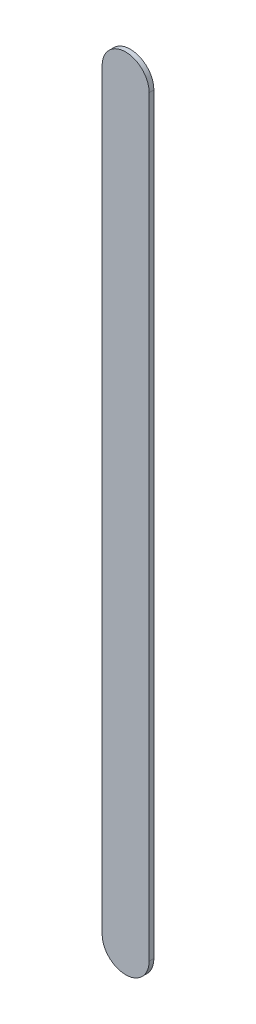
ISO-10303-21;
HEADER;
FILE_DESCRIPTION(('STEP AP214'),'2;1');
FILE_NAME('part.step','',(''),(''),'','','');
FILE_SCHEMA(('AUTOMOTIVE_DESIGN { 1 0 10303 214 1 1 1 1 }'));
ENDSEC;
DATA;
#1=APPLICATION_CONTEXT('core data for automotive mechanical design processes');
#2=APPLICATION_PROTOCOL_DEFINITION('international standard','automotive_design',2000,#1);
#3=PRODUCT_CONTEXT('',#1,'mechanical');
#4=PRODUCT('Part','Part','',(#3));
#5=PRODUCT_RELATED_PRODUCT_CATEGORY('part','',(#4));
#6=PRODUCT_DEFINITION_FORMATION('','',#4);
#7=PRODUCT_DEFINITION_CONTEXT('part definition',#1,'design');
#8=PRODUCT_DEFINITION('design','',#6,#7);
#9=PRODUCT_DEFINITION_SHAPE('','',#8);
#10=(LENGTH_UNIT() NAMED_UNIT(*) SI_UNIT(.MILLI.,.METRE.));
#11=(NAMED_UNIT(*) PLANE_ANGLE_UNIT() SI_UNIT($,.RADIAN.));
#12=(NAMED_UNIT(*) SI_UNIT($,.STERADIAN.) SOLID_ANGLE_UNIT());
#13=UNCERTAINTY_MEASURE_WITH_UNIT(LENGTH_MEASURE(1.E-05),#10,'distance_accuracy_value','');
#14=(GEOMETRIC_REPRESENTATION_CONTEXT(3) GLOBAL_UNCERTAINTY_ASSIGNED_CONTEXT((#13)) GLOBAL_UNIT_ASSIGNED_CONTEXT((#10,
#11,#12)) REPRESENTATION_CONTEXT('',''));
#15=CARTESIAN_POINT('',(0.,0.,0.));
#16=DIRECTION('',(0.,0.,1.));
#17=DIRECTION('',(1.,0.,0.));
#18=AXIS2_PLACEMENT_3D('',#15,#16,#17);
#19=CARTESIAN_POINT('',(14.648999633789,36.399998779297,0.0127));
#20=DIRECTION('',(0.,0.,1.));
#21=DIRECTION('',(1.,0.,0.));
#22=AXIS2_PLACEMENT_3D('',#19,#20,#21);
#23=PLANE('',#22);
#24=CARTESIAN_POINT('',(14.648999633789,35.383998413086,0.0127));
#25=DIRECTION('',(0.,0.,-1.));
#26=DIRECTION('',(1.,0.,0.));
#27=AXIS2_PLACEMENT_3D('',#24,#25,#26);
#28=CIRCLE('',#27,0.06350036621387);
#29=CARTESIAN_POINT('',(14.7125,35.383998718262,0.0127));
#30=VERTEX_POINT('',#29);
#31=CARTESIAN_POINT('',(14.585499267577,35.383998413086,0.0127));
#32=VERTEX_POINT('',#31);
#33=EDGE_CURVE('E100',#30,#32,#28,.T.);
#34=ORIENTED_EDGE('',*,*,#33,.F.);
#35=DIRECTION('',(0.,1.,0.));
#36=VECTOR('',#35,1.);
#37=CARTESIAN_POINT('',(14.7125,37.415998535156,0.0127));
#38=LINE('',#37,#36);
#39=CARTESIAN_POINT('',(14.712500000001,37.415999145508,0.0127));
#40=VERTEX_POINT('',#39);
#41=EDGE_CURVE('E70',#30,#40,#38,.T.);
#42=ORIENTED_EDGE('',*,*,#41,.T.);
#43=CARTESIAN_POINT('',(14.648999633789,37.415999145508,0.0127));
#44=DIRECTION('',(0.,0.,1.));
#45=DIRECTION('',(1.,0.,0.));
#46=AXIS2_PLACEMENT_3D('',#43,#44,#45);
#47=CIRCLE('',#46,0.06350036621387);
#48=CARTESIAN_POINT('',(14.585499267578,37.415998840332,0.0127));
#49=VERTEX_POINT('',#48);
#50=EDGE_CURVE('E94',#40,#49,#47,.T.);
#51=ORIENTED_EDGE('',*,*,#50,.T.);
#52=DIRECTION('',(0.,-1.,0.));
#53=VECTOR('',#52,1.);
#54=CARTESIAN_POINT('',(14.585499267578,35.383999023438,0.0127));
#55=LINE('',#54,#53);
#56=EDGE_CURVE('E11',#49,#32,#55,.T.);
#57=ORIENTED_EDGE('',*,*,#56,.T.);
#58=EDGE_LOOP('',(#34,#42,#51,#57));
#59=FACE_BOUND('',#58,.T.);
#60=ADVANCED_FACE('F17',(#59),#23,.T.);
#61=CARTESIAN_POINT('',(14.585499267578,35.383999023438,0.));
#62=DIRECTION('',(1.,0.,0.));
#63=DIRECTION('',(0.,1.,0.));
#64=AXIS2_PLACEMENT_3D('',#61,#62,#63);
#65=PLANE('',#64);
#66=DIRECTION('',(0.,0.,1.));
#67=VECTOR('',#66,1.);
#68=CARTESIAN_POINT('',(14.585499267578,37.415998535156,0.));
#69=LINE('',#68,#67);
#70=CARTESIAN_POINT('',(14.585499267578,37.415998840332,0.));
#71=VERTEX_POINT('',#70);
#72=EDGE_CURVE('E97',#71,#49,#69,.T.);
#73=ORIENTED_EDGE('',*,*,#72,.F.);
#74=DIRECTION('',(0.,-1.,0.));
#75=VECTOR('',#74,1.);
#76=CARTESIAN_POINT('',(14.585499267578,36.399998779297,0.));
#77=LINE('',#76,#75);
#78=CARTESIAN_POINT('',(14.585499267577,35.383998413086,0.));
#79=VERTEX_POINT('',#78);
#80=EDGE_CURVE('E82',#71,#79,#77,.T.);
#81=ORIENTED_EDGE('',*,*,#80,.T.);
#82=DIRECTION('',(0.,0.,-1.));
#83=VECTOR('',#82,1.);
#84=CARTESIAN_POINT('',(14.585499267575,35.383998413086,0.));
#85=LINE('',#84,#83);
#86=EDGE_CURVE('E28',#32,#79,#85,.T.);
#87=ORIENTED_EDGE('',*,*,#86,.F.);
#88=ORIENTED_EDGE('',*,*,#56,.F.);
#89=EDGE_LOOP('',(#73,#81,#87,#88));
#90=FACE_BOUND('',#89,.T.);
#91=ADVANCED_FACE('F19',(#90),#65,.F.);
#92=CARTESIAN_POINT('',(14.648999633789,35.383998413086,0.));
#93=DIRECTION('',(0.,0.,1.));
#94=DIRECTION('',(1.,0.,0.));
#95=AXIS2_PLACEMENT_3D('',#92,#93,#94);
#96=CYLINDRICAL_SURFACE('',#95,0.06350036621387);
#97=DIRECTION('',(0.,0.,1.));
#98=VECTOR('',#97,1.);
#99=CARTESIAN_POINT('',(14.7125,35.383999023438,0.));
#100=LINE('',#99,#98);
#101=CARTESIAN_POINT('',(14.7125,35.383998718262,0.));
#102=VERTEX_POINT('',#101);
#103=EDGE_CURVE('E21',#102,#30,#100,.T.);
#104=ORIENTED_EDGE('',*,*,#103,.T.);
#105=ORIENTED_EDGE('',*,*,#33,.T.);
#106=ORIENTED_EDGE('',*,*,#86,.T.);
#107=CARTESIAN_POINT('',(14.648999633789,35.383998413086,0.));
#108=DIRECTION('',(0.,0.,1.));
#109=DIRECTION('',(1.,0.,0.));
#110=AXIS2_PLACEMENT_3D('',#107,#108,#109);
#111=CIRCLE('',#110,0.06350036621387);
#112=EDGE_CURVE('E76',#79,#102,#111,.T.);
#113=ORIENTED_EDGE('',*,*,#112,.T.);
#114=EDGE_LOOP('',(#104,#105,#106,#113));
#115=FACE_BOUND('',#114,.T.);
#116=ADVANCED_FACE('F77',(#115),#96,.T.);
#117=CARTESIAN_POINT('',(14.7125,37.415998535156,0.));
#118=DIRECTION('',(-1.,0.,0.));
#119=DIRECTION('',(0.,0.,1.));
#120=AXIS2_PLACEMENT_3D('',#117,#118,#119);
#121=PLANE('',#120);
#122=ORIENTED_EDGE('',*,*,#103,.F.);
#123=DIRECTION('',(0.,1.,0.));
#124=VECTOR('',#123,1.);
#125=CARTESIAN_POINT('',(14.7125,36.399998779297,0.));
#126=LINE('',#125,#124);
#127=CARTESIAN_POINT('',(14.712500000001,37.415999145508,0.));
#128=VERTEX_POINT('',#127);
#129=EDGE_CURVE('E69',#102,#128,#126,.T.);
#130=ORIENTED_EDGE('',*,*,#129,.T.);
#131=DIRECTION('',(0.,0.,-1.));
#132=VECTOR('',#131,1.);
#133=CARTESIAN_POINT('',(14.712500000003,37.415999145508,0.));
#134=LINE('',#133,#132);
#135=EDGE_CURVE('E74',#40,#128,#134,.T.);
#136=ORIENTED_EDGE('',*,*,#135,.F.);
#137=ORIENTED_EDGE('',*,*,#41,.F.);
#138=EDGE_LOOP('',(#122,#130,#136,#137));
#139=FACE_BOUND('',#138,.T.);
#140=ADVANCED_FACE('F66',(#139),#121,.F.);
#141=CARTESIAN_POINT('',(14.648999633789,37.415999145508,0.));
#142=DIRECTION('',(0.,0.,1.));
#143=DIRECTION('',(1.,0.,0.));
#144=AXIS2_PLACEMENT_3D('',#141,#142,#143);
#145=CYLINDRICAL_SURFACE('',#144,0.06350036621387);
#146=ORIENTED_EDGE('',*,*,#72,.T.);
#147=ORIENTED_EDGE('',*,*,#50,.F.);
#148=ORIENTED_EDGE('',*,*,#135,.T.);
#149=CARTESIAN_POINT('',(14.648999633789,37.415999145508,0.));
#150=DIRECTION('',(0.,0.,1.));
#151=DIRECTION('',(1.,0.,0.));
#152=AXIS2_PLACEMENT_3D('',#149,#150,#151);
#153=CIRCLE('',#152,0.06350036621387);
#154=EDGE_CURVE('E87',#128,#71,#153,.T.);
#155=ORIENTED_EDGE('',*,*,#154,.T.);
#156=EDGE_LOOP('',(#146,#147,#148,#155));
#157=FACE_BOUND('',#156,.T.);
#158=ADVANCED_FACE('F170',(#157),#145,.T.);
#159=CARTESIAN_POINT('',(14.648999633789,36.399998779297,0.));
#160=DIRECTION('',(0.,0.,1.));
#161=DIRECTION('',(1.,0.,0.));
#162=AXIS2_PLACEMENT_3D('',#159,#160,#161);
#163=PLANE('',#162);
#164=ORIENTED_EDGE('',*,*,#129,.F.);
#165=ORIENTED_EDGE('',*,*,#112,.F.);
#166=ORIENTED_EDGE('',*,*,#80,.F.);
#167=ORIENTED_EDGE('',*,*,#154,.F.);
#168=EDGE_LOOP('',(#164,#165,#166,#167));
#169=FACE_BOUND('',#168,.T.);
#170=ADVANCED_FACE('F85',(#169),#163,.F.);
#171=CLOSED_SHELL('',(#60,#91,#116,#140,#158,#170));
#172=MANIFOLD_SOLID_BREP('B1',#171);
#173=ADVANCED_BREP_SHAPE_REPRESENTATION('',(#18,#172),#14);
#174=SHAPE_DEFINITION_REPRESENTATION(#9,#173);
ENDSEC;
END-ISO-10303-21;
